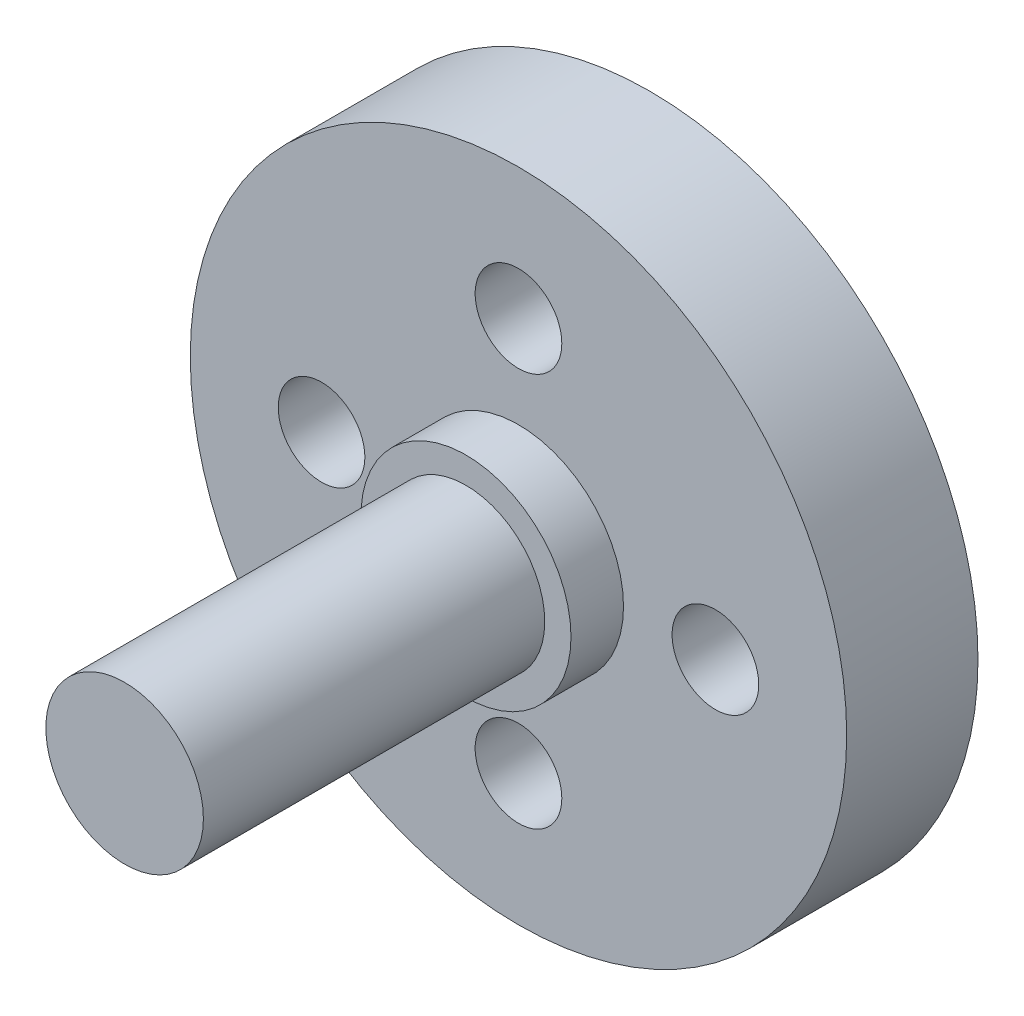
ISO-10303-21;
HEADER;
FILE_DESCRIPTION(('STEP AP214'),'2;1');
FILE_NAME('part.step','',(''),(''),'','','');
FILE_SCHEMA(('AUTOMOTIVE_DESIGN { 1 0 10303 214 1 1 1 1 }'));
ENDSEC;
DATA;
#1=APPLICATION_CONTEXT('core data for automotive mechanical design processes');
#2=APPLICATION_PROTOCOL_DEFINITION('international standard','automotive_design',2000,#1);
#3=PRODUCT_CONTEXT('',#1,'mechanical');
#4=PRODUCT('Part','Part','',(#3));
#5=PRODUCT_RELATED_PRODUCT_CATEGORY('part','',(#4));
#6=PRODUCT_DEFINITION_FORMATION('','',#4);
#7=PRODUCT_DEFINITION_CONTEXT('part definition',#1,'design');
#8=PRODUCT_DEFINITION('design','',#6,#7);
#9=PRODUCT_DEFINITION_SHAPE('','',#8);
#10=(LENGTH_UNIT() NAMED_UNIT(*) SI_UNIT(.MILLI.,.METRE.));
#11=(NAMED_UNIT(*) PLANE_ANGLE_UNIT() SI_UNIT($,.RADIAN.));
#12=(NAMED_UNIT(*) SI_UNIT($,.STERADIAN.) SOLID_ANGLE_UNIT());
#13=UNCERTAINTY_MEASURE_WITH_UNIT(LENGTH_MEASURE(1.E-05),#10,'distance_accuracy_value','');
#14=(GEOMETRIC_REPRESENTATION_CONTEXT(3) GLOBAL_UNCERTAINTY_ASSIGNED_CONTEXT((#13)) GLOBAL_UNIT_ASSIGNED_CONTEXT((#10,
#11,#12)) REPRESENTATION_CONTEXT('',''));
#15=CARTESIAN_POINT('',(0.,0.,0.));
#16=DIRECTION('',(0.,0.,1.));
#17=DIRECTION('',(1.,0.,0.));
#18=AXIS2_PLACEMENT_3D('',#15,#16,#17);
#19=CARTESIAN_POINT('',(0.,0.,5.));
#20=DIRECTION('',(0.,0.,-1.));
#21=DIRECTION('',(-1.,0.,0.));
#22=AXIS2_PLACEMENT_3D('',#19,#20,#21);
#23=CYLINDRICAL_SURFACE('',#22,12.5);
#24=CARTESIAN_POINT('',(0.,0.,5.));
#25=DIRECTION('',(0.,0.,1.));
#26=DIRECTION('',(1.,0.,0.));
#27=AXIS2_PLACEMENT_3D('',#24,#25,#26);
#28=CIRCLE('',#27,12.5);
#29=CARTESIAN_POINT('',(12.5,0.,5.));
#30=VERTEX_POINT('',#29);
#31=EDGE_CURVE('E45',#30,#30,#28,.T.);
#32=ORIENTED_EDGE('',*,*,#31,.F.);
#33=EDGE_LOOP('',(#32));
#34=FACE_BOUND('',#33,.T.);
#35=CARTESIAN_POINT('',(0.,0.,0.));
#36=DIRECTION('',(0.,0.,1.));
#37=DIRECTION('',(1.,0.,0.));
#38=AXIS2_PLACEMENT_3D('',#35,#36,#37);
#39=CIRCLE('',#38,12.5);
#40=CARTESIAN_POINT('',(12.5,0.,0.));
#41=VERTEX_POINT('',#40);
#42=EDGE_CURVE('E36',#41,#41,#39,.T.);
#43=ORIENTED_EDGE('',*,*,#42,.T.);
#44=EDGE_LOOP('',(#43));
#45=FACE_BOUND('',#44,.T.);
#46=ADVANCED_FACE('F33',(#34,#45),#23,.T.);
#47=CARTESIAN_POINT('',(0.,0.,5.));
#48=DIRECTION('',(0.,0.,1.));
#49=DIRECTION('',(1.,0.,0.));
#50=AXIS2_PLACEMENT_3D('',#47,#48,#49);
#51=PLANE('',#50);
#52=CARTESIAN_POINT('',(0.,7.5,5.));
#53=DIRECTION('',(0.,0.,1.));
#54=DIRECTION('',(1.,0.,0.));
#55=AXIS2_PLACEMENT_3D('',#52,#53,#54);
#56=CIRCLE('',#55,1.65);
#57=CARTESIAN_POINT('',(1.65,7.5,5.));
#58=VERTEX_POINT('',#57);
#59=EDGE_CURVE('E177',#58,#58,#56,.T.);
#60=ORIENTED_EDGE('',*,*,#59,.F.);
#61=EDGE_LOOP('',(#60));
#62=FACE_BOUND('',#61,.T.);
#63=CARTESIAN_POINT('',(7.5,0.,5.));
#64=DIRECTION('',(0.,0.,1.));
#65=DIRECTION('',(1.,0.,0.));
#66=AXIS2_PLACEMENT_3D('',#63,#64,#65);
#67=CIRCLE('',#66,1.65);
#68=CARTESIAN_POINT('',(9.15,0.,5.));
#69=VERTEX_POINT('',#68);
#70=EDGE_CURVE('E185',#69,#69,#67,.T.);
#71=ORIENTED_EDGE('',*,*,#70,.F.);
#72=EDGE_LOOP('',(#71));
#73=FACE_BOUND('',#72,.T.);
#74=CARTESIAN_POINT('',(0.,-7.5,5.));
#75=DIRECTION('',(0.,0.,1.));
#76=DIRECTION('',(1.,0.,0.));
#77=AXIS2_PLACEMENT_3D('',#74,#75,#76);
#78=CIRCLE('',#77,1.65);
#79=CARTESIAN_POINT('',(1.65,-7.5,5.));
#80=VERTEX_POINT('',#79);
#81=EDGE_CURVE('E191',#80,#80,#78,.T.);
#82=ORIENTED_EDGE('',*,*,#81,.F.);
#83=EDGE_LOOP('',(#82));
#84=FACE_BOUND('',#83,.T.);
#85=CARTESIAN_POINT('',(-7.5,0.,5.));
#86=DIRECTION('',(0.,0.,1.));
#87=DIRECTION('',(1.,0.,0.));
#88=AXIS2_PLACEMENT_3D('',#85,#86,#87);
#89=CIRCLE('',#88,1.65);
#90=CARTESIAN_POINT('',(-5.85,0.,5.));
#91=VERTEX_POINT('',#90);
#92=EDGE_CURVE('E196',#91,#91,#89,.T.);
#93=ORIENTED_EDGE('',*,*,#92,.F.);
#94=EDGE_LOOP('',(#93));
#95=FACE_BOUND('',#94,.T.);
#96=CARTESIAN_POINT('',(0.,0.,5.));
#97=DIRECTION('',(0.,0.,1.));
#98=DIRECTION('',(1.,0.,0.));
#99=AXIS2_PLACEMENT_3D('',#96,#97,#98);
#100=CIRCLE('',#99,4.);
#101=CARTESIAN_POINT('',(4.,0.,5.));
#102=VERTEX_POINT('',#101);
#103=EDGE_CURVE('E40',#102,#102,#100,.T.);
#104=ORIENTED_EDGE('',*,*,#103,.F.);
#105=EDGE_LOOP('',(#104));
#106=FACE_BOUND('',#105,.T.);
#107=ORIENTED_EDGE('',*,*,#31,.T.);
#108=EDGE_LOOP('',(#107));
#109=FACE_BOUND('',#108,.T.);
#110=ADVANCED_FACE('F63',(#62,#73,#84,#95,#106,#109),#51,.T.);
#111=CARTESIAN_POINT('',(0.,0.,0.));
#112=DIRECTION('',(0.,0.,1.));
#113=DIRECTION('',(1.,0.,0.));
#114=AXIS2_PLACEMENT_3D('',#111,#112,#113);
#115=PLANE('',#114);
#116=CARTESIAN_POINT('',(0.,7.5,0.));
#117=DIRECTION('',(0.,0.,1.));
#118=DIRECTION('',(1.,0.,0.));
#119=AXIS2_PLACEMENT_3D('',#116,#117,#118);
#120=CIRCLE('',#119,1.65);
#121=CARTESIAN_POINT('',(1.65,7.5,0.));
#122=VERTEX_POINT('',#121);
#123=EDGE_CURVE('E176',#122,#122,#120,.T.);
#124=ORIENTED_EDGE('',*,*,#123,.T.);
#125=EDGE_LOOP('',(#124));
#126=FACE_BOUND('',#125,.T.);
#127=CARTESIAN_POINT('',(7.5,0.,0.));
#128=DIRECTION('',(0.,0.,1.));
#129=DIRECTION('',(1.,0.,0.));
#130=AXIS2_PLACEMENT_3D('',#127,#128,#129);
#131=CIRCLE('',#130,1.65);
#132=CARTESIAN_POINT('',(9.15,0.,0.));
#133=VERTEX_POINT('',#132);
#134=EDGE_CURVE('E180',#133,#133,#131,.T.);
#135=ORIENTED_EDGE('',*,*,#134,.T.);
#136=EDGE_LOOP('',(#135));
#137=FACE_BOUND('',#136,.T.);
#138=CARTESIAN_POINT('',(0.,-7.5,0.));
#139=DIRECTION('',(0.,0.,1.));
#140=DIRECTION('',(1.,0.,0.));
#141=AXIS2_PLACEMENT_3D('',#138,#139,#140);
#142=CIRCLE('',#141,1.65);
#143=CARTESIAN_POINT('',(1.65,-7.5,0.));
#144=VERTEX_POINT('',#143);
#145=EDGE_CURVE('E188',#144,#144,#142,.T.);
#146=ORIENTED_EDGE('',*,*,#145,.T.);
#147=EDGE_LOOP('',(#146));
#148=FACE_BOUND('',#147,.T.);
#149=CARTESIAN_POINT('',(-7.5,0.,0.));
#150=DIRECTION('',(0.,0.,1.));
#151=DIRECTION('',(1.,0.,0.));
#152=AXIS2_PLACEMENT_3D('',#149,#150,#151);
#153=CIRCLE('',#152,1.65);
#154=CARTESIAN_POINT('',(-5.85,0.,0.));
#155=VERTEX_POINT('',#154);
#156=EDGE_CURVE('E194',#155,#155,#153,.T.);
#157=ORIENTED_EDGE('',*,*,#156,.T.);
#158=EDGE_LOOP('',(#157));
#159=FACE_BOUND('',#158,.T.);
#160=ORIENTED_EDGE('',*,*,#42,.F.);
#161=EDGE_LOOP('',(#160));
#162=FACE_BOUND('',#161,.T.);
#163=ADVANCED_FACE('F60',(#126,#137,#148,#159,#162),#115,.F.);
#164=CARTESIAN_POINT('',(0.,0.,7.));
#165=DIRECTION('',(0.,0.,-1.));
#166=DIRECTION('',(-1.,0.,0.));
#167=AXIS2_PLACEMENT_3D('',#164,#165,#166);
#168=CYLINDRICAL_SURFACE('',#167,4.);
#169=CARTESIAN_POINT('',(0.,0.,7.));
#170=DIRECTION('',(0.,0.,1.));
#171=DIRECTION('',(1.,0.,0.));
#172=AXIS2_PLACEMENT_3D('',#169,#170,#171);
#173=CIRCLE('',#172,4.);
#174=CARTESIAN_POINT('',(4.,0.,7.));
#175=VERTEX_POINT('',#174);
#176=EDGE_CURVE('E51',#175,#175,#173,.T.);
#177=ORIENTED_EDGE('',*,*,#176,.F.);
#178=EDGE_LOOP('',(#177));
#179=FACE_BOUND('',#178,.T.);
#180=ORIENTED_EDGE('',*,*,#103,.T.);
#181=EDGE_LOOP('',(#180));
#182=FACE_BOUND('',#181,.T.);
#183=ADVANCED_FACE('F62',(#179,#182),#168,.T.);
#184=CARTESIAN_POINT('',(0.,0.,7.));
#185=DIRECTION('',(0.,0.,1.));
#186=DIRECTION('',(1.,0.,0.));
#187=AXIS2_PLACEMENT_3D('',#184,#185,#186);
#188=PLANE('',#187);
#189=CARTESIAN_POINT('',(0.,0.,7.));
#190=DIRECTION('',(0.,0.,1.));
#191=DIRECTION('',(1.,0.,0.));
#192=AXIS2_PLACEMENT_3D('',#189,#190,#191);
#193=CIRCLE('',#192,3.);
#194=CARTESIAN_POINT('',(3.,0.,7.));
#195=VERTEX_POINT('',#194);
#196=EDGE_CURVE('E10',#195,#195,#193,.T.);
#197=ORIENTED_EDGE('',*,*,#196,.F.);
#198=EDGE_LOOP('',(#197));
#199=FACE_BOUND('',#198,.T.);
#200=ORIENTED_EDGE('',*,*,#176,.T.);
#201=EDGE_LOOP('',(#200));
#202=FACE_BOUND('',#201,.T.);
#203=ADVANCED_FACE('F69',(#199,#202),#188,.T.);
#204=CARTESIAN_POINT('',(0.,0.,20.));
#205=DIRECTION('',(0.,0.,-1.));
#206=DIRECTION('',(-1.,0.,0.));
#207=AXIS2_PLACEMENT_3D('',#204,#205,#206);
#208=CYLINDRICAL_SURFACE('',#207,3.);
#209=CARTESIAN_POINT('',(0.,0.,20.));
#210=DIRECTION('',(0.,0.,1.));
#211=DIRECTION('',(1.,0.,0.));
#212=AXIS2_PLACEMENT_3D('',#209,#210,#211);
#213=CIRCLE('',#212,3.);
#214=CARTESIAN_POINT('',(3.,0.,20.));
#215=VERTEX_POINT('',#214);
#216=EDGE_CURVE('E49',#215,#215,#213,.T.);
#217=ORIENTED_EDGE('',*,*,#216,.F.);
#218=EDGE_LOOP('',(#217));
#219=FACE_BOUND('',#218,.T.);
#220=ORIENTED_EDGE('',*,*,#196,.T.);
#221=EDGE_LOOP('',(#220));
#222=FACE_BOUND('',#221,.T.);
#223=ADVANCED_FACE('F144',(#219,#222),#208,.T.);
#224=CARTESIAN_POINT('',(0.,0.,20.));
#225=DIRECTION('',(0.,0.,1.));
#226=DIRECTION('',(1.,0.,0.));
#227=AXIS2_PLACEMENT_3D('',#224,#225,#226);
#228=PLANE('',#227);
#229=ORIENTED_EDGE('',*,*,#216,.T.);
#230=EDGE_LOOP('',(#229));
#231=FACE_BOUND('',#230,.T.);
#232=ADVANCED_FACE('F91',(#231),#228,.T.);
#233=CARTESIAN_POINT('',(-7.5,0.,0.));
#234=DIRECTION('',(0.,0.,1.));
#235=DIRECTION('',(1.,0.,0.));
#236=AXIS2_PLACEMENT_3D('',#233,#234,#235);
#237=CYLINDRICAL_SURFACE('',#236,1.65);
#238=ORIENTED_EDGE('',*,*,#156,.F.);
#239=EDGE_LOOP('',(#238));
#240=FACE_BOUND('',#239,.T.);
#241=ORIENTED_EDGE('',*,*,#92,.T.);
#242=EDGE_LOOP('',(#241));
#243=FACE_BOUND('',#242,.T.);
#244=ADVANCED_FACE('F101',(#240,#243),#237,.F.);
#245=CARTESIAN_POINT('',(0.,-7.5,0.));
#246=DIRECTION('',(0.,0.,1.));
#247=DIRECTION('',(1.,0.,0.));
#248=AXIS2_PLACEMENT_3D('',#245,#246,#247);
#249=CYLINDRICAL_SURFACE('',#248,1.65);
#250=ORIENTED_EDGE('',*,*,#145,.F.);
#251=EDGE_LOOP('',(#250));
#252=FACE_BOUND('',#251,.T.);
#253=ORIENTED_EDGE('',*,*,#81,.T.);
#254=EDGE_LOOP('',(#253));
#255=FACE_BOUND('',#254,.T.);
#256=ADVANCED_FACE('F106',(#252,#255),#249,.F.);
#257=CARTESIAN_POINT('',(7.5,0.,0.));
#258=DIRECTION('',(0.,0.,1.));
#259=DIRECTION('',(1.,0.,0.));
#260=AXIS2_PLACEMENT_3D('',#257,#258,#259);
#261=CYLINDRICAL_SURFACE('',#260,1.65);
#262=ORIENTED_EDGE('',*,*,#134,.F.);
#263=EDGE_LOOP('',(#262));
#264=FACE_BOUND('',#263,.T.);
#265=ORIENTED_EDGE('',*,*,#70,.T.);
#266=EDGE_LOOP('',(#265));
#267=FACE_BOUND('',#266,.T.);
#268=ADVANCED_FACE('F116',(#264,#267),#261,.F.);
#269=CARTESIAN_POINT('',(0.,7.5,0.));
#270=DIRECTION('',(0.,0.,1.));
#271=DIRECTION('',(1.,0.,0.));
#272=AXIS2_PLACEMENT_3D('',#269,#270,#271);
#273=CYLINDRICAL_SURFACE('',#272,1.65);
#274=ORIENTED_EDGE('',*,*,#123,.F.);
#275=EDGE_LOOP('',(#274));
#276=FACE_BOUND('',#275,.T.);
#277=ORIENTED_EDGE('',*,*,#59,.T.);
#278=EDGE_LOOP('',(#277));
#279=FACE_BOUND('',#278,.T.);
#280=ADVANCED_FACE('F126',(#276,#279),#273,.F.);
#281=CLOSED_SHELL('',(#46,#110,#163,#183,#203,#223,#232,#244,#256,#268,#280));
#282=MANIFOLD_SOLID_BREP('B2',#281);
#283=ADVANCED_BREP_SHAPE_REPRESENTATION('',(#18,#282),#14);
#284=SHAPE_DEFINITION_REPRESENTATION(#9,#283);
ENDSEC;
END-ISO-10303-21;
